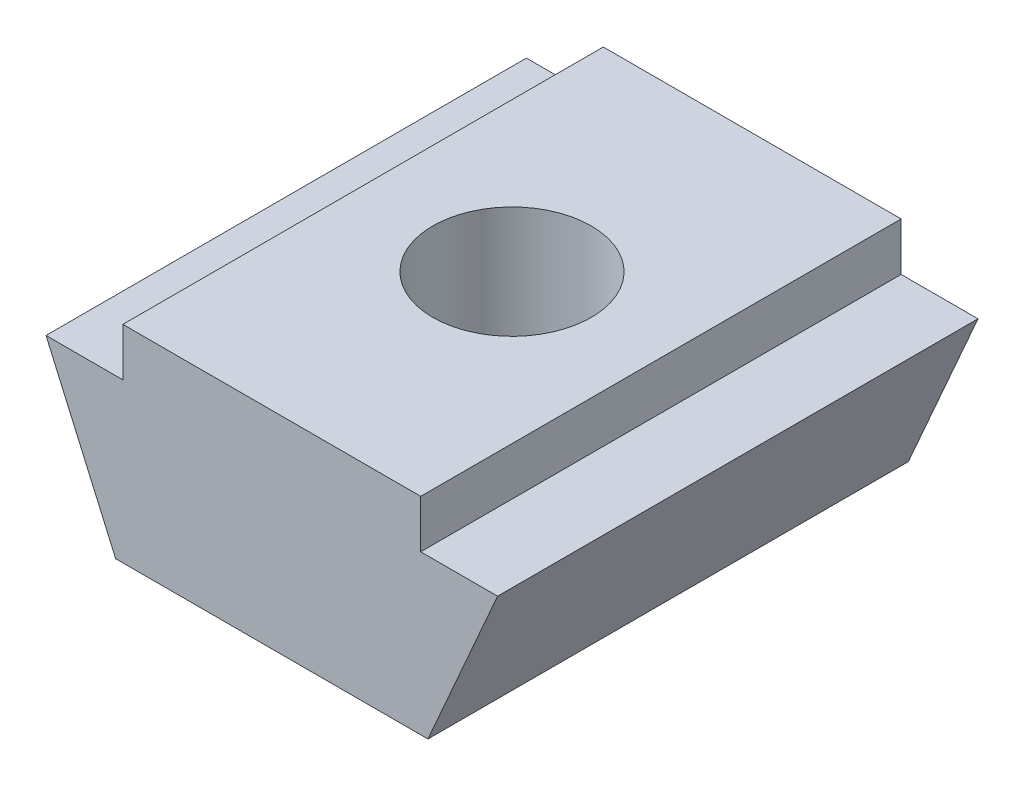
ISO-10303-21;
HEADER;
FILE_DESCRIPTION(('STEP AP214'),'2;1');
FILE_NAME('part.step','',(''),(''),'','','');
FILE_SCHEMA(('AUTOMOTIVE_DESIGN { 1 0 10303 214 1 1 1 1 }'));
ENDSEC;
DATA;
#1=APPLICATION_CONTEXT('core data for automotive mechanical design processes');
#2=APPLICATION_PROTOCOL_DEFINITION('international standard','automotive_design',2000,#1);
#3=PRODUCT_CONTEXT('',#1,'mechanical');
#4=PRODUCT('Part','Part','',(#3));
#5=PRODUCT_RELATED_PRODUCT_CATEGORY('part','',(#4));
#6=PRODUCT_DEFINITION_FORMATION('','',#4);
#7=PRODUCT_DEFINITION_CONTEXT('part definition',#1,'design');
#8=PRODUCT_DEFINITION('design','',#6,#7);
#9=PRODUCT_DEFINITION_SHAPE('','',#8);
#10=(LENGTH_UNIT() NAMED_UNIT(*) SI_UNIT(.MILLI.,.METRE.));
#11=(NAMED_UNIT(*) PLANE_ANGLE_UNIT() SI_UNIT($,.RADIAN.));
#12=(NAMED_UNIT(*) SI_UNIT($,.STERADIAN.) SOLID_ANGLE_UNIT());
#13=UNCERTAINTY_MEASURE_WITH_UNIT(LENGTH_MEASURE(1.E-05),#10,'distance_accuracy_value','');
#14=(GEOMETRIC_REPRESENTATION_CONTEXT(3) GLOBAL_UNCERTAINTY_ASSIGNED_CONTEXT((#13)) GLOBAL_UNIT_ASSIGNED_CONTEXT((#10,
#11,#12)) REPRESENTATION_CONTEXT('',''));
#15=CARTESIAN_POINT('',(0.,0.,0.));
#16=DIRECTION('',(0.,0.,1.));
#17=DIRECTION('',(1.,0.,0.));
#18=AXIS2_PLACEMENT_3D('',#15,#16,#17);
#19=CARTESIAN_POINT('',(3.25,0.,5.));
#20=DIRECTION('',(-0.915519454023032,0.402273699494969,0.));
#21=DIRECTION('',(-0.402273699494969,-0.915519454023032,0.));
#22=AXIS2_PLACEMENT_3D('',#19,#20,#21);
#23=PLANE('',#22);
#24=DIRECTION('',(0.402273699494969,0.915519454023032,0.));
#25=VECTOR('',#24,1.);
#26=CARTESIAN_POINT('',(3.25,0.,-5.));
#27=LINE('',#26,#25);
#28=CARTESIAN_POINT('',(3.25,0.,-5.));
#29=VERTEX_POINT('',#28);
#30=CARTESIAN_POINT('',(4.7,3.3,-5.));
#31=VERTEX_POINT('',#30);
#32=EDGE_CURVE('E141',#29,#31,#27,.T.);
#33=ORIENTED_EDGE('',*,*,#32,.T.);
#34=DIRECTION('',(0.,0.,-1.));
#35=VECTOR('',#34,1.);
#36=CARTESIAN_POINT('',(4.7,3.3,5.));
#37=LINE('',#36,#35);
#38=CARTESIAN_POINT('',(4.7,3.3,5.));
#39=VERTEX_POINT('',#38);
#40=EDGE_CURVE('E11',#39,#31,#37,.T.);
#41=ORIENTED_EDGE('',*,*,#40,.F.);
#42=DIRECTION('',(0.402273699494969,0.915519454023032,0.));
#43=VECTOR('',#42,1.);
#44=CARTESIAN_POINT('',(3.25,0.,5.));
#45=LINE('',#44,#43);
#46=CARTESIAN_POINT('',(3.25,0.,5.));
#47=VERTEX_POINT('',#46);
#48=EDGE_CURVE('E163',#47,#39,#45,.T.);
#49=ORIENTED_EDGE('',*,*,#48,.F.);
#50=DIRECTION('',(0.,0.,-1.));
#51=VECTOR('',#50,1.);
#52=CARTESIAN_POINT('',(3.25,0.,5.));
#53=LINE('',#52,#51);
#54=EDGE_CURVE('E137',#47,#29,#53,.T.);
#55=ORIENTED_EDGE('',*,*,#54,.T.);
#56=EDGE_LOOP('',(#33,#41,#49,#55));
#57=FACE_BOUND('',#56,.T.);
#58=ADVANCED_FACE('F39',(#57),#23,.F.);
#59=CARTESIAN_POINT('',(4.7,3.3,5.));
#60=DIRECTION('',(0.,-1.,0.));
#61=DIRECTION('',(1.,0.,0.));
#62=AXIS2_PLACEMENT_3D('',#59,#60,#61);
#63=PLANE('',#62);
#64=DIRECTION('',(-1.,0.,0.));
#65=VECTOR('',#64,1.);
#66=CARTESIAN_POINT('',(4.7,3.3,-5.));
#67=LINE('',#66,#65);
#68=CARTESIAN_POINT('',(3.1,3.3,-5.));
#69=VERTEX_POINT('',#68);
#70=EDGE_CURVE('E145',#31,#69,#67,.T.);
#71=ORIENTED_EDGE('',*,*,#70,.T.);
#72=DIRECTION('',(0.,0.,-1.));
#73=VECTOR('',#72,1.);
#74=CARTESIAN_POINT('',(3.1,3.3,5.));
#75=LINE('',#74,#73);
#76=CARTESIAN_POINT('',(3.1,3.3,5.));
#77=VERTEX_POINT('',#76);
#78=EDGE_CURVE('E49',#77,#69,#75,.T.);
#79=ORIENTED_EDGE('',*,*,#78,.F.);
#80=DIRECTION('',(-1.,0.,0.));
#81=VECTOR('',#80,1.);
#82=CARTESIAN_POINT('',(4.7,3.3,5.));
#83=LINE('',#82,#81);
#84=EDGE_CURVE('E100',#39,#77,#83,.T.);
#85=ORIENTED_EDGE('',*,*,#84,.F.);
#86=ORIENTED_EDGE('',*,*,#40,.T.);
#87=EDGE_LOOP('',(#71,#79,#85,#86));
#88=FACE_BOUND('',#87,.T.);
#89=ADVANCED_FACE('F228',(#88),#63,.F.);
#90=CARTESIAN_POINT('',(3.1,3.3,5.));
#91=DIRECTION('',(-1.,0.,0.));
#92=DIRECTION('',(0.,-1.,0.));
#93=AXIS2_PLACEMENT_3D('',#90,#91,#92);
#94=PLANE('',#93);
#95=DIRECTION('',(0.,1.,0.));
#96=VECTOR('',#95,1.);
#97=CARTESIAN_POINT('',(3.1,3.3,-5.));
#98=LINE('',#97,#96);
#99=CARTESIAN_POINT('',(3.1,4.3,-5.));
#100=VERTEX_POINT('',#99);
#101=EDGE_CURVE('E148',#69,#100,#98,.T.);
#102=ORIENTED_EDGE('',*,*,#101,.T.);
#103=DIRECTION('',(0.,0.,-1.));
#104=VECTOR('',#103,1.);
#105=CARTESIAN_POINT('',(3.1,4.3,5.));
#106=LINE('',#105,#104);
#107=CARTESIAN_POINT('',(3.1,4.3,5.));
#108=VERTEX_POINT('',#107);
#109=EDGE_CURVE('E174',#108,#100,#106,.T.);
#110=ORIENTED_EDGE('',*,*,#109,.F.);
#111=DIRECTION('',(0.,1.,0.));
#112=VECTOR('',#111,1.);
#113=CARTESIAN_POINT('',(3.1,3.3,5.));
#114=LINE('',#113,#112);
#115=EDGE_CURVE('E185',#77,#108,#114,.T.);
#116=ORIENTED_EDGE('',*,*,#115,.F.);
#117=ORIENTED_EDGE('',*,*,#78,.T.);
#118=EDGE_LOOP('',(#102,#110,#116,#117));
#119=FACE_BOUND('',#118,.T.);
#120=ADVANCED_FACE('F183',(#119),#94,.F.);
#121=CARTESIAN_POINT('',(3.1,4.3,5.));
#122=DIRECTION('',(0.,-1.,0.));
#123=DIRECTION('',(0.,0.,-1.));
#124=AXIS2_PLACEMENT_3D('',#121,#122,#123);
#125=PLANE('',#124);
#126=CARTESIAN_POINT('',(0.,4.3,0.));
#127=DIRECTION('',(0.,1.,0.));
#128=DIRECTION('',(0.,0.,1.));
#129=AXIS2_PLACEMENT_3D('',#126,#127,#128);
#130=CIRCLE('',#129,1.64999999999999);
#131=CARTESIAN_POINT('',(0.,4.3,1.64999999999999));
#132=VERTEX_POINT('',#131);
#133=EDGE_CURVE('E208',#132,#132,#130,.T.);
#134=ORIENTED_EDGE('',*,*,#133,.F.);
#135=EDGE_LOOP('',(#134));
#136=FACE_BOUND('',#135,.T.);
#137=DIRECTION('',(-1.,0.,0.));
#138=VECTOR('',#137,1.);
#139=CARTESIAN_POINT('',(3.1,4.3,-5.));
#140=LINE('',#139,#138);
#141=CARTESIAN_POINT('',(-3.1,4.3,-5.));
#142=VERTEX_POINT('',#141);
#143=EDGE_CURVE('E151',#100,#142,#140,.T.);
#144=ORIENTED_EDGE('',*,*,#143,.T.);
#145=DIRECTION('',(0.,0.,-1.));
#146=VECTOR('',#145,1.);
#147=CARTESIAN_POINT('',(-3.1,4.3,5.));
#148=LINE('',#147,#146);
#149=CARTESIAN_POINT('',(-3.1,4.3,5.));
#150=VERTEX_POINT('',#149);
#151=EDGE_CURVE('E170',#150,#142,#148,.T.);
#152=ORIENTED_EDGE('',*,*,#151,.F.);
#153=DIRECTION('',(-1.,0.,0.));
#154=VECTOR('',#153,1.);
#155=CARTESIAN_POINT('',(3.1,4.3,5.));
#156=LINE('',#155,#154);
#157=EDGE_CURVE('E198',#108,#150,#156,.T.);
#158=ORIENTED_EDGE('',*,*,#157,.F.);
#159=ORIENTED_EDGE('',*,*,#109,.T.);
#160=EDGE_LOOP('',(#144,#152,#158,#159));
#161=FACE_BOUND('',#160,.T.);
#162=ADVANCED_FACE('F193',(#136,#161),#125,.F.);
#163=CARTESIAN_POINT('',(-3.1,3.3,5.));
#164=DIRECTION('',(1.,0.,0.));
#165=DIRECTION('',(0.,1.,0.));
#166=AXIS2_PLACEMENT_3D('',#163,#164,#165);
#167=PLANE('',#166);
#168=DIRECTION('',(0.,-1.,0.));
#169=VECTOR('',#168,1.);
#170=CARTESIAN_POINT('',(-3.1,3.3,-5.));
#171=LINE('',#170,#169);
#172=CARTESIAN_POINT('',(-3.1,3.3,-5.));
#173=VERTEX_POINT('',#172);
#174=EDGE_CURVE('E154',#142,#173,#171,.T.);
#175=ORIENTED_EDGE('',*,*,#174,.T.);
#176=DIRECTION('',(0.,0.,-1.));
#177=VECTOR('',#176,1.);
#178=CARTESIAN_POINT('',(-3.1,3.3,5.));
#179=LINE('',#178,#177);
#180=CARTESIAN_POINT('',(-3.1,3.3,5.));
#181=VERTEX_POINT('',#180);
#182=EDGE_CURVE('E130',#181,#173,#179,.T.);
#183=ORIENTED_EDGE('',*,*,#182,.F.);
#184=DIRECTION('',(0.,-1.,0.));
#185=VECTOR('',#184,1.);
#186=CARTESIAN_POINT('',(-3.1,3.3,5.));
#187=LINE('',#186,#185);
#188=EDGE_CURVE('E119',#150,#181,#187,.T.);
#189=ORIENTED_EDGE('',*,*,#188,.F.);
#190=ORIENTED_EDGE('',*,*,#151,.T.);
#191=EDGE_LOOP('',(#175,#183,#189,#190));
#192=FACE_BOUND('',#191,.T.);
#193=ADVANCED_FACE('F196',(#192),#167,.F.);
#194=CARTESIAN_POINT('',(-4.7,3.3,5.));
#195=DIRECTION('',(0.,-1.,0.));
#196=DIRECTION('',(1.,0.,0.));
#197=AXIS2_PLACEMENT_3D('',#194,#195,#196);
#198=PLANE('',#197);
#199=DIRECTION('',(-1.,0.,0.));
#200=VECTOR('',#199,1.);
#201=CARTESIAN_POINT('',(-4.7,3.3,-5.));
#202=LINE('',#201,#200);
#203=CARTESIAN_POINT('',(-4.7,3.3,-5.));
#204=VERTEX_POINT('',#203);
#205=EDGE_CURVE('E128',#173,#204,#202,.T.);
#206=ORIENTED_EDGE('',*,*,#205,.T.);
#207=DIRECTION('',(0.,0.,-1.));
#208=VECTOR('',#207,1.);
#209=CARTESIAN_POINT('',(-4.7,3.3,5.));
#210=LINE('',#209,#208);
#211=CARTESIAN_POINT('',(-4.7,3.3,5.));
#212=VERTEX_POINT('',#211);
#213=EDGE_CURVE('E125',#212,#204,#210,.T.);
#214=ORIENTED_EDGE('',*,*,#213,.F.);
#215=DIRECTION('',(-1.,0.,0.));
#216=VECTOR('',#215,1.);
#217=CARTESIAN_POINT('',(-4.7,3.3,5.));
#218=LINE('',#217,#216);
#219=EDGE_CURVE('E113',#181,#212,#218,.T.);
#220=ORIENTED_EDGE('',*,*,#219,.F.);
#221=ORIENTED_EDGE('',*,*,#182,.T.);
#222=EDGE_LOOP('',(#206,#214,#220,#221));
#223=FACE_BOUND('',#222,.T.);
#224=ADVANCED_FACE('F126',(#223),#198,.F.);
#225=CARTESIAN_POINT('',(-3.25,0.,5.));
#226=DIRECTION('',(0.915519454023032,0.402273699494969,0.));
#227=DIRECTION('',(-0.402273699494969,0.915519454023032,0.));
#228=AXIS2_PLACEMENT_3D('',#225,#226,#227);
#229=PLANE('',#228);
#230=DIRECTION('',(0.402273699494969,-0.915519454023032,0.));
#231=VECTOR('',#230,1.);
#232=CARTESIAN_POINT('',(-3.25,0.,-5.));
#233=LINE('',#232,#231);
#234=CARTESIAN_POINT('',(-3.25,0.,-5.));
#235=VERTEX_POINT('',#234);
#236=EDGE_CURVE('E86',#204,#235,#233,.T.);
#237=ORIENTED_EDGE('',*,*,#236,.T.);
#238=DIRECTION('',(0.,0.,-1.));
#239=VECTOR('',#238,1.);
#240=CARTESIAN_POINT('',(-3.25,0.,5.));
#241=LINE('',#240,#239);
#242=CARTESIAN_POINT('',(-3.25,0.,5.));
#243=VERTEX_POINT('',#242);
#244=EDGE_CURVE('E131',#243,#235,#241,.T.);
#245=ORIENTED_EDGE('',*,*,#244,.F.);
#246=DIRECTION('',(0.402273699494969,-0.915519454023032,0.));
#247=VECTOR('',#246,1.);
#248=CARTESIAN_POINT('',(-3.25,0.,5.));
#249=LINE('',#248,#247);
#250=EDGE_CURVE('E117',#212,#243,#249,.T.);
#251=ORIENTED_EDGE('',*,*,#250,.F.);
#252=ORIENTED_EDGE('',*,*,#213,.T.);
#253=EDGE_LOOP('',(#237,#245,#251,#252));
#254=FACE_BOUND('',#253,.T.);
#255=ADVANCED_FACE('F133',(#254),#229,.F.);
#256=CARTESIAN_POINT('',(-3.25,0.,5.));
#257=DIRECTION('',(0.,1.,0.));
#258=DIRECTION('',(0.,0.,1.));
#259=AXIS2_PLACEMENT_3D('',#256,#257,#258);
#260=PLANE('',#259);
#261=CARTESIAN_POINT('',(0.,0.,0.));
#262=DIRECTION('',(0.,1.,0.));
#263=DIRECTION('',(0.,0.,1.));
#264=AXIS2_PLACEMENT_3D('',#261,#262,#263);
#265=CIRCLE('',#264,1.64999999999999);
#266=CARTESIAN_POINT('',(0.,0.,1.64999999999999));
#267=VERTEX_POINT('',#266);
#268=EDGE_CURVE('E42',#267,#267,#265,.T.);
#269=ORIENTED_EDGE('',*,*,#268,.T.);
#270=EDGE_LOOP('',(#269));
#271=FACE_BOUND('',#270,.T.);
#272=DIRECTION('',(1.,0.,0.));
#273=VECTOR('',#272,1.);
#274=CARTESIAN_POINT('',(-3.25,0.,-5.));
#275=LINE('',#274,#273);
#276=EDGE_CURVE('E92',#235,#29,#275,.T.);
#277=ORIENTED_EDGE('',*,*,#276,.T.);
#278=ORIENTED_EDGE('',*,*,#54,.F.);
#279=DIRECTION('',(1.,0.,0.));
#280=VECTOR('',#279,1.);
#281=CARTESIAN_POINT('',(-3.25,0.,5.));
#282=LINE('',#281,#280);
#283=EDGE_CURVE('E57',#243,#47,#282,.T.);
#284=ORIENTED_EDGE('',*,*,#283,.F.);
#285=ORIENTED_EDGE('',*,*,#244,.T.);
#286=EDGE_LOOP('',(#277,#278,#284,#285));
#287=FACE_BOUND('',#286,.T.);
#288=ADVANCED_FACE('F217',(#271,#287),#260,.F.);
#289=CARTESIAN_POINT('',(0.,0.,5.));
#290=DIRECTION('',(0.,0.,1.));
#291=DIRECTION('',(1.,0.,0.));
#292=AXIS2_PLACEMENT_3D('',#289,#290,#291);
#293=PLANE('',#292);
#294=ORIENTED_EDGE('',*,*,#48,.T.);
#295=ORIENTED_EDGE('',*,*,#84,.T.);
#296=ORIENTED_EDGE('',*,*,#115,.T.);
#297=ORIENTED_EDGE('',*,*,#157,.T.);
#298=ORIENTED_EDGE('',*,*,#188,.T.);
#299=ORIENTED_EDGE('',*,*,#219,.T.);
#300=ORIENTED_EDGE('',*,*,#250,.T.);
#301=ORIENTED_EDGE('',*,*,#283,.T.);
#302=EDGE_LOOP('',(#294,#295,#296,#297,#298,#299,#300,#301));
#303=FACE_BOUND('',#302,.T.);
#304=ADVANCED_FACE('F115',(#303),#293,.T.);
#305=CARTESIAN_POINT('',(0.,0.,-5.));
#306=DIRECTION('',(0.,0.,1.));
#307=DIRECTION('',(1.,0.,0.));
#308=AXIS2_PLACEMENT_3D('',#305,#306,#307);
#309=PLANE('',#308);
#310=ORIENTED_EDGE('',*,*,#32,.F.);
#311=ORIENTED_EDGE('',*,*,#276,.F.);
#312=ORIENTED_EDGE('',*,*,#236,.F.);
#313=ORIENTED_EDGE('',*,*,#205,.F.);
#314=ORIENTED_EDGE('',*,*,#174,.F.);
#315=ORIENTED_EDGE('',*,*,#143,.F.);
#316=ORIENTED_EDGE('',*,*,#101,.F.);
#317=ORIENTED_EDGE('',*,*,#70,.F.);
#318=EDGE_LOOP('',(#310,#311,#312,#313,#314,#315,#316,#317));
#319=FACE_BOUND('',#318,.T.);
#320=ADVANCED_FACE('F189',(#319),#309,.F.);
#321=CARTESIAN_POINT('',(0.,4.3,0.));
#322=DIRECTION('',(0.,1.,0.));
#323=DIRECTION('',(0.,0.,1.));
#324=AXIS2_PLACEMENT_3D('',#321,#322,#323);
#325=CYLINDRICAL_SURFACE('',#324,1.64999999999999);
#326=ORIENTED_EDGE('',*,*,#133,.T.);
#327=EDGE_LOOP('',(#326));
#328=FACE_BOUND('',#327,.T.);
#329=ORIENTED_EDGE('',*,*,#268,.F.);
#330=EDGE_LOOP('',(#329));
#331=FACE_BOUND('',#330,.T.);
#332=ADVANCED_FACE('F219',(#328,#331),#325,.F.);
#333=CLOSED_SHELL('',(#58,#89,#120,#162,#193,#224,#255,#288,#304,#320,#332));
#334=MANIFOLD_SOLID_BREP('B2',#333);
#335=ADVANCED_BREP_SHAPE_REPRESENTATION('',(#18,#334),#14);
#336=SHAPE_DEFINITION_REPRESENTATION(#9,#335);
ENDSEC;
END-ISO-10303-21;
